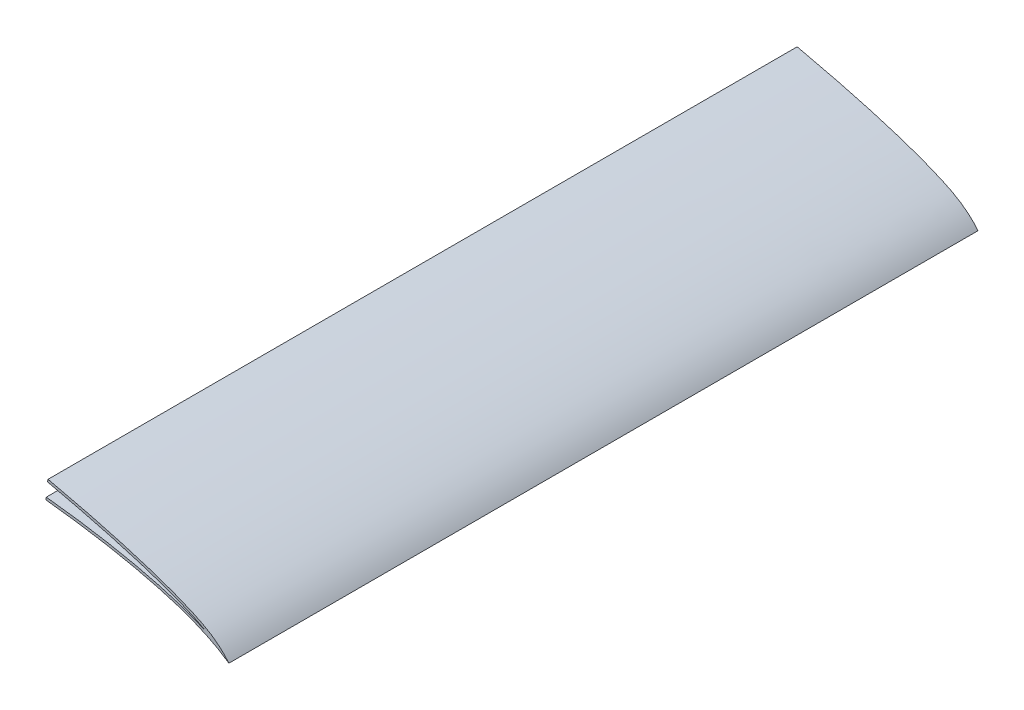
ISO-10303-21;
HEADER;
FILE_DESCRIPTION(('STEP AP214'),'2;1');
FILE_NAME('part.step','',(''),(''),'','','');
FILE_SCHEMA(('AUTOMOTIVE_DESIGN { 1 0 10303 214 1 1 1 1 }'));
ENDSEC;
DATA;
#1=APPLICATION_CONTEXT('core data for automotive mechanical design processes');
#2=APPLICATION_PROTOCOL_DEFINITION('international standard','automotive_design',2000,#1);
#3=PRODUCT_CONTEXT('',#1,'mechanical');
#4=PRODUCT('Part','Part','',(#3));
#5=PRODUCT_RELATED_PRODUCT_CATEGORY('part','',(#4));
#6=PRODUCT_DEFINITION_FORMATION('','',#4);
#7=PRODUCT_DEFINITION_CONTEXT('part definition',#1,'design');
#8=PRODUCT_DEFINITION('design','',#6,#7);
#9=PRODUCT_DEFINITION_SHAPE('','',#8);
#10=(LENGTH_UNIT() NAMED_UNIT(*) SI_UNIT(.MILLI.,.METRE.));
#11=(NAMED_UNIT(*) PLANE_ANGLE_UNIT() SI_UNIT($,.RADIAN.));
#12=(NAMED_UNIT(*) SI_UNIT($,.STERADIAN.) SOLID_ANGLE_UNIT());
#13=UNCERTAINTY_MEASURE_WITH_UNIT(LENGTH_MEASURE(1.E-05),#10,'distance_accuracy_value','');
#14=(GEOMETRIC_REPRESENTATION_CONTEXT(3) GLOBAL_UNCERTAINTY_ASSIGNED_CONTEXT((#13)) GLOBAL_UNIT_ASSIGNED_CONTEXT((#10,
#11,#12)) REPRESENTATION_CONTEXT('',''));
#15=CARTESIAN_POINT('',(0.,0.,0.));
#16=DIRECTION('',(0.,0.,1.));
#17=DIRECTION('',(1.,0.,0.));
#18=AXIS2_PLACEMENT_3D('',#15,#16,#17);
#19=CARTESIAN_POINT('',(681.10239979939,357.442024641771,-776.88119407791));
#20=CARTESIAN_POINT('',(679.304249684024,358.507222216952,-776.88119407791));
#21=CARTESIAN_POINT('',(675.611115854921,360.442697269166,-776.88119407791));
#22=CARTESIAN_POINT('',(667.897968409566,363.914761834944,-776.88119407791));
#23=CARTESIAN_POINT('',(658.02890147387,367.768621452563,-776.88119407791));
#24=CARTESIAN_POINT('',(645.962941296988,371.875785824504,-776.88119407791));
#25=CARTESIAN_POINT('',(629.698668264069,376.857765233191,-776.88119407791));
#26=CARTESIAN_POINT('',(609.14271959352,382.390632282122,-776.88119407791));
#27=CARTESIAN_POINT('',(592.558644621646,386.308749724352,-776.88119407791));
#28=CARTESIAN_POINT('',(584.246414259336,388.168240850974,-776.88119407791));
#29=B_SPLINE_CURVE_WITH_KNOTS('',3,(#19,#20,#21,#22,#23,#24,#25,#26,#27,#28),.UNSPECIFIED.,.F.,
.F.,(4,1,1,1,1,1,1,4),(0.0310566948795872,0.0410473310177227,0.0510379671558582,
0.0710192394321292,0.0910005117084002,0.110981783984671,0.150944328537213,0.190906873089755),.UNSPECIFIED.);
#30=DIRECTION('',(0.,0.,1.));
#31=VECTOR('',#30,1.);
#32=SURFACE_OF_LINEAR_EXTRUSION('',#29,#31);
#33=CARTESIAN_POINT('',(681.10239979939,357.442024641771,-319.68119407791));
#34=CARTESIAN_POINT('',(679.304249684024,358.507222216952,-319.68119407791));
#35=CARTESIAN_POINT('',(675.611115854921,360.442697269166,-319.68119407791));
#36=CARTESIAN_POINT('',(667.897968409566,363.914761834944,-319.68119407791));
#37=CARTESIAN_POINT('',(658.02890147387,367.768621452563,-319.68119407791));
#38=CARTESIAN_POINT('',(645.962941296988,371.875785824504,-319.68119407791));
#39=CARTESIAN_POINT('',(629.698668264069,376.857765233191,-319.68119407791));
#40=CARTESIAN_POINT('',(609.14271959352,382.390632282122,-319.68119407791));
#41=CARTESIAN_POINT('',(592.558644621646,386.308749724352,-319.68119407791));
#42=CARTESIAN_POINT('',(584.246414259336,388.168240850974,-319.68119407791));
#43=B_SPLINE_CURVE_WITH_KNOTS('',3,(#33,#34,#35,#36,#37,#38,#39,#40,#41,#42),.UNSPECIFIED.,.F.,
.F.,(4,1,1,1,1,1,1,4),(0.0310566948795872,0.0410473310177227,0.0510379671558582,
0.0710192394321292,0.0910005117084002,0.110981783984671,0.150944328537213,0.190906873089755),.UNSPECIFIED.);
#44=CARTESIAN_POINT('',(681.10239979939,357.442024641771,-319.68119407791));
#45=VERTEX_POINT('',#44);
#46=CARTESIAN_POINT('',(584.246414259336,388.168240850974,-319.68119407791));
#47=VERTEX_POINT('',#46);
#48=EDGE_CURVE('E126',#45,#47,#43,.T.);
#49=ORIENTED_EDGE('',*,*,#48,.T.);
#50=DIRECTION('',(0.,0.,1.));
#51=VECTOR('',#50,1.);
#52=CARTESIAN_POINT('',(584.246414259336,388.168240850974,-776.88119407791));
#53=LINE('',#52,#51);
#54=CARTESIAN_POINT('',(584.246414259336,388.168240850974,-776.88119407791));
#55=VERTEX_POINT('',#54);
#56=EDGE_CURVE('E39',#55,#47,#53,.T.);
#57=ORIENTED_EDGE('',*,*,#56,.F.);
#58=CARTESIAN_POINT('',(681.10239979939,357.442024641771,-776.88119407791));
#59=VERTEX_POINT('',#58);
#60=EDGE_CURVE('E155',#59,#55,#29,.T.);
#61=ORIENTED_EDGE('',*,*,#60,.F.);
#62=DIRECTION('',(0.,0.,1.));
#63=VECTOR('',#62,1.);
#64=CARTESIAN_POINT('',(681.10239979939,357.442024641771,-776.88119407791));
#65=LINE('',#64,#63);
#66=EDGE_CURVE('E11',#59,#45,#65,.T.);
#67=ORIENTED_EDGE('',*,*,#66,.T.);
#68=EDGE_LOOP('',(#49,#57,#61,#67));
#69=FACE_BOUND('',#68,.T.);
#70=ADVANCED_FACE('F35',(#69),#32,.F.);
#71=CARTESIAN_POINT('',(583.510331137067,379.741149772631,-776.88119407791));
#72=CARTESIAN_POINT('',(591.8136724064,378.84005328922,-776.88119407791));
#73=CARTESIAN_POINT('',(608.384907828173,376.714386581783,-776.88119407791));
#74=CARTESIAN_POINT('',(633.079929040534,372.32439926868,-776.88119407791));
#75=CARTESIAN_POINT('',(653.436794257841,367.438773544325,-776.88119407791));
#76=CARTESIAN_POINT('',(669.437307682216,362.364981006689,-776.88119407791));
#77=CARTESIAN_POINT('',(677.28280112468,359.2195131916,-776.88119407791));
#78=CARTESIAN_POINT('',(681.10239979939,357.442024641771,-776.88119407791));
#79=B_SPLINE_CURVE_WITH_KNOTS('',3,(#71,#72,#73,#74,#75,#76,#77,#78),.UNSPECIFIED.,.F.,.F.,(4,1,
1,1,1,4),(0.805836243842012,0.846446639249514,0.887057034657015,0.927667430064517,
0.947972627768268,0.968277825472018),.UNSPECIFIED.);
#80=DIRECTION('',(0.,0.,1.));
#81=VECTOR('',#80,1.);
#82=SURFACE_OF_LINEAR_EXTRUSION('',#79,#81);
#83=CARTESIAN_POINT('',(583.510331137067,379.741149772631,-319.68119407791));
#84=CARTESIAN_POINT('',(591.8136724064,378.84005328922,-319.68119407791));
#85=CARTESIAN_POINT('',(608.384907828173,376.714386581783,-319.68119407791));
#86=CARTESIAN_POINT('',(633.079929040534,372.32439926868,-319.68119407791));
#87=CARTESIAN_POINT('',(653.436794257841,367.438773544325,-319.68119407791));
#88=CARTESIAN_POINT('',(669.437307682216,362.364981006689,-319.68119407791));
#89=CARTESIAN_POINT('',(677.28280112468,359.2195131916,-319.68119407791));
#90=CARTESIAN_POINT('',(681.10239979939,357.442024641771,-319.68119407791));
#91=B_SPLINE_CURVE_WITH_KNOTS('',3,(#83,#84,#85,#86,#87,#88,#89,#90),.UNSPECIFIED.,.F.,.F.,(4,1,
1,1,1,4),(0.805836243842012,0.846446639249514,0.887057034657015,0.927667430064517,
0.947972627768268,0.968277825472018),.UNSPECIFIED.);
#92=CARTESIAN_POINT('',(583.510331137067,379.741149772631,-319.68119407791));
#93=VERTEX_POINT('',#92);
#94=EDGE_CURVE('E83',#93,#45,#91,.T.);
#95=ORIENTED_EDGE('',*,*,#94,.T.);
#96=ORIENTED_EDGE('',*,*,#66,.F.);
#97=CARTESIAN_POINT('',(583.510331137067,379.741149772631,-776.88119407791));
#98=VERTEX_POINT('',#97);
#99=EDGE_CURVE('E54',#98,#59,#79,.T.);
#100=ORIENTED_EDGE('',*,*,#99,.F.);
#101=DIRECTION('',(0.,0.,1.));
#102=VECTOR('',#101,1.);
#103=CARTESIAN_POINT('',(583.510331137067,379.741149772631,-776.88119407791));
#104=LINE('',#103,#102);
#105=EDGE_CURVE('E45',#98,#93,#104,.T.);
#106=ORIENTED_EDGE('',*,*,#105,.T.);
#107=EDGE_LOOP('',(#95,#96,#100,#106));
#108=FACE_BOUND('',#107,.T.);
#109=ADVANCED_FACE('F134',(#108),#82,.F.);
#110=CARTESIAN_POINT('',(583.510331137067,379.741149772631,-776.88119407791));
#111=DIRECTION('',(-0.994162977907549,0.107888708204309,0.));
#112=DIRECTION('',(-0.107888708204309,-0.994162977907549,0.));
#113=AXIS2_PLACEMENT_3D('',#110,#111,#112);
#114=PLANE('',#113);
#115=DIRECTION('',(0.107888708204309,0.994162977907549,0.));
#116=VECTOR('',#115,1.);
#117=CARTESIAN_POINT('',(583.510331137067,379.741149772631,-319.68119407791));
#118=LINE('',#117,#116);
#119=CARTESIAN_POINT('',(583.339057812792,378.162916045203,-319.68119407791));
#120=VERTEX_POINT('',#119);
#121=EDGE_CURVE('E77',#120,#93,#118,.T.);
#122=ORIENTED_EDGE('',*,*,#121,.T.);
#123=ORIENTED_EDGE('',*,*,#105,.F.);
#124=DIRECTION('',(0.107888708204309,0.994162977907549,0.));
#125=VECTOR('',#124,1.);
#126=CARTESIAN_POINT('',(583.510331137067,379.741149772631,-776.88119407791));
#127=LINE('',#126,#125);
#128=CARTESIAN_POINT('',(583.339057812792,378.162916045203,-776.88119407791));
#129=VERTEX_POINT('',#128);
#130=EDGE_CURVE('E102',#129,#98,#127,.T.);
#131=ORIENTED_EDGE('',*,*,#130,.F.);
#132=DIRECTION('',(0.,0.,1.));
#133=VECTOR('',#132,1.);
#134=CARTESIAN_POINT('',(583.339057812792,378.162916045203,-776.88119407791));
#135=LINE('',#134,#133);
#136=EDGE_CURVE('E109',#129,#120,#135,.T.);
#137=ORIENTED_EDGE('',*,*,#136,.T.);
#138=EDGE_LOOP('',(#122,#123,#131,#137));
#139=FACE_BOUND('',#138,.T.);
#140=ADVANCED_FACE('F115',(#139),#114,.T.);
#141=CARTESIAN_POINT('',(694.960862648591,347.678083459518,-776.88119407791));
#142=CARTESIAN_POINT('',(691.029024667533,350.467217019644,-776.88119407791));
#143=CARTESIAN_POINT('',(682.671305419235,355.295271927614,-776.88119407791));
#144=CARTESIAN_POINT('',(669.098277724682,360.859120529805,-776.88119407791));
#145=CARTESIAN_POINT('',(655.150353556945,365.206363312461,-776.88119407791));
#146=CARTESIAN_POINT('',(636.268825679498,370.004149324542,-776.88119407791));
#147=CARTESIAN_POINT('',(612.334315947761,374.563254744285,-776.88119407791));
#148=CARTESIAN_POINT('',(593.01938034853,377.112386588168,-776.88119407791));
#149=CARTESIAN_POINT('',(583.339057812792,378.162916045203,-776.88119407791));
#150=B_SPLINE_CURVE_WITH_KNOTS('',3,(#141,#142,#143,#144,#145,#146,#147,#148,#149),
.UNSPECIFIED.,.F.,.F.,(4,1,1,1,1,1,4),(0.778364638353046,0.802103786742917,0.825842935132789,
0.84958208352266,0.873321231912532,0.920799528692275,0.968277825472017),.UNSPECIFIED.);
#151=DIRECTION('',(0.,0.,1.));
#152=VECTOR('',#151,1.);
#153=SURFACE_OF_LINEAR_EXTRUSION('',#150,#152);
#154=CARTESIAN_POINT('',(694.960862648591,347.678083459518,-319.68119407791));
#155=CARTESIAN_POINT('',(691.029024667533,350.467217019644,-319.68119407791));
#156=CARTESIAN_POINT('',(682.671305419235,355.295271927614,-319.68119407791));
#157=CARTESIAN_POINT('',(669.098277724682,360.859120529805,-319.68119407791));
#158=CARTESIAN_POINT('',(655.150353556945,365.206363312461,-319.68119407791));
#159=CARTESIAN_POINT('',(636.268825679498,370.004149324542,-319.68119407791));
#160=CARTESIAN_POINT('',(612.334315947761,374.563254744285,-319.68119407791));
#161=CARTESIAN_POINT('',(593.01938034853,377.112386588168,-319.68119407791));
#162=CARTESIAN_POINT('',(583.339057812792,378.162916045203,-319.68119407791));
#163=B_SPLINE_CURVE_WITH_KNOTS('',3,(#154,#155,#156,#157,#158,#159,#160,#161,#162),
.UNSPECIFIED.,.F.,.F.,(4,1,1,1,1,1,4),(0.778364638353046,0.802103786742917,0.825842935132789,
0.84958208352266,0.873321231912532,0.920799528692275,0.968277825472017),.UNSPECIFIED.);
#164=CARTESIAN_POINT('',(694.960862648591,347.678083459518,-319.68119407791));
#165=VERTEX_POINT('',#164);
#166=EDGE_CURVE('E112',#165,#120,#163,.T.);
#167=ORIENTED_EDGE('',*,*,#166,.T.);
#168=ORIENTED_EDGE('',*,*,#136,.F.);
#169=CARTESIAN_POINT('',(694.960862648591,347.678083459518,-776.88119407791));
#170=VERTEX_POINT('',#169);
#171=EDGE_CURVE('E98',#170,#129,#150,.T.);
#172=ORIENTED_EDGE('',*,*,#171,.F.);
#173=DIRECTION('',(0.,0.,1.));
#174=VECTOR('',#173,1.);
#175=CARTESIAN_POINT('',(694.960862648591,347.678083459518,-776.88119407791));
#176=LINE('',#175,#174);
#177=EDGE_CURVE('E113',#170,#165,#176,.T.);
#178=ORIENTED_EDGE('',*,*,#177,.T.);
#179=EDGE_LOOP('',(#167,#168,#172,#178));
#180=FACE_BOUND('',#179,.T.);
#181=ADVANCED_FACE('F110',(#180),#153,.F.);
#182=CARTESIAN_POINT('',(584.592980694727,389.717449667067,-776.88119407791));
#183=CARTESIAN_POINT('',(594.2390289314,387.559576229826,-776.88119407791));
#184=CARTESIAN_POINT('',(608.665062264766,384.125823447073,-776.88119407791));
#185=CARTESIAN_POINT('',(627.762599784587,379.000812102591,-776.88119407791));
#186=CARTESIAN_POINT('',(641.985832617223,374.815696622757,-776.88119407791));
#187=CARTESIAN_POINT('',(653.728443854595,370.955138889617,-776.88119407791));
#188=CARTESIAN_POINT('',(663.00422729933,367.537908093301,-776.88119407791));
#189=CARTESIAN_POINT('',(669.877072896808,364.763096926528,-776.88119407791));
#190=CARTESIAN_POINT('',(676.654462618841,361.727818738977,-776.88119407791));
#191=CARTESIAN_POINT('',(682.087698437832,358.81395797082,-776.88119407791));
#192=CARTESIAN_POINT('',(686.264097225263,356.011835466178,-776.88119407791));
#193=CARTESIAN_POINT('',(689.293606327259,353.621302194878,-776.88119407791));
#194=CARTESIAN_POINT('',(691.722959725977,351.338504762297,-776.88119407791));
#195=CARTESIAN_POINT('',(693.593228521658,349.322103903293,-776.88119407791));
#196=CARTESIAN_POINT('',(694.516463088209,348.229332832381,-776.88119407791));
#197=CARTESIAN_POINT('',(694.960862648591,347.678083459518,-776.88119407791));
#198=B_SPLINE_CURVE_WITH_KNOTS('',3,(#182,#183,#184,#185,#186,#187,#188,#189,#190,#191,#192,
#193,#194,#195,#196,#197),.UNSPECIFIED.,.F.,.F.,(4,1,1,1,1,1,1,1,1,1,1,1,1,4),
(0.0310566948795878,0.0773530996556797,0.100501302043726,0.123649504431772,0.146797706819817,
0.15837180801384,0.169945909207863,0.181520010401886,0.193094111595909,0.198881162192921,
0.204668212789932,0.210455263386944,0.213348788685449,0.216242313983955),.UNSPECIFIED.);
#199=DIRECTION('',(0.,0.,1.));
#200=VECTOR('',#199,1.);
#201=SURFACE_OF_LINEAR_EXTRUSION('',#198,#200);
#202=CARTESIAN_POINT('',(584.592980694727,389.717449667067,-319.68119407791));
#203=CARTESIAN_POINT('',(594.2390289314,387.559576229826,-319.68119407791));
#204=CARTESIAN_POINT('',(608.665062264766,384.125823447073,-319.68119407791));
#205=CARTESIAN_POINT('',(627.762599784587,379.000812102591,-319.68119407791));
#206=CARTESIAN_POINT('',(641.985832617223,374.815696622757,-319.68119407791));
#207=CARTESIAN_POINT('',(653.728443854595,370.955138889617,-319.68119407791));
#208=CARTESIAN_POINT('',(663.00422729933,367.537908093301,-319.68119407791));
#209=CARTESIAN_POINT('',(669.877072896808,364.763096926528,-319.68119407791));
#210=CARTESIAN_POINT('',(676.654462618841,361.727818738977,-319.68119407791));
#211=CARTESIAN_POINT('',(682.087698437832,358.81395797082,-319.68119407791));
#212=CARTESIAN_POINT('',(686.264097225263,356.011835466178,-319.68119407791));
#213=CARTESIAN_POINT('',(689.293606327259,353.621302194878,-319.68119407791));
#214=CARTESIAN_POINT('',(691.722959725977,351.338504762297,-319.68119407791));
#215=CARTESIAN_POINT('',(693.593228521658,349.322103903293,-319.68119407791));
#216=CARTESIAN_POINT('',(694.516463088209,348.229332832381,-319.68119407791));
#217=CARTESIAN_POINT('',(694.960862648591,347.678083459518,-319.68119407791));
#218=B_SPLINE_CURVE_WITH_KNOTS('',3,(#202,#203,#204,#205,#206,#207,#208,#209,#210,#211,#212,
#213,#214,#215,#216,#217),.UNSPECIFIED.,.F.,.F.,(4,1,1,1,1,1,1,1,1,1,1,1,1,4),
(0.0310566948795878,0.0773530996556797,0.100501302043726,0.123649504431772,0.146797706819817,
0.15837180801384,0.169945909207863,0.181520010401886,0.193094111595909,0.198881162192921,
0.204668212789932,0.210455263386944,0.213348788685449,0.216242313983955),.UNSPECIFIED.);
#219=CARTESIAN_POINT('',(584.592980694727,389.717449667067,-319.68119407791));
#220=VERTEX_POINT('',#219);
#221=EDGE_CURVE('E182',#220,#165,#218,.T.);
#222=ORIENTED_EDGE('',*,*,#221,.T.);
#223=ORIENTED_EDGE('',*,*,#177,.F.);
#224=CARTESIAN_POINT('',(584.592980694727,389.717449667067,-776.88119407791));
#225=VERTEX_POINT('',#224);
#226=EDGE_CURVE('E104',#225,#170,#198,.T.);
#227=ORIENTED_EDGE('',*,*,#226,.F.);
#228=DIRECTION('',(0.,0.,1.));
#229=VECTOR('',#228,1.);
#230=CARTESIAN_POINT('',(584.592980694727,389.717449667067,-776.88119407791));
#231=LINE('',#230,#229);
#232=EDGE_CURVE('E174',#225,#220,#231,.T.);
#233=ORIENTED_EDGE('',*,*,#232,.T.);
#234=EDGE_LOOP('',(#222,#223,#227,#233));
#235=FACE_BOUND('',#234,.T.);
#236=ADVANCED_FACE('F144',(#235),#201,.F.);
#237=CARTESIAN_POINT('',(584.246414259336,388.168240850974,-776.88119407791));
#238=DIRECTION('',(-0.975879569192483,0.218309565600535,0.));
#239=DIRECTION('',(-0.218309565600535,-0.975879569192483,0.));
#240=AXIS2_PLACEMENT_3D('',#237,#238,#239);
#241=PLANE('',#240);
#242=DIRECTION('',(0.218309565600535,0.975879569192483,0.));
#243=VECTOR('',#242,1.);
#244=CARTESIAN_POINT('',(584.246414259336,388.168240850974,-319.68119407791));
#245=LINE('',#244,#243);
#246=EDGE_CURVE('E178',#47,#220,#245,.T.);
#247=ORIENTED_EDGE('',*,*,#246,.T.);
#248=ORIENTED_EDGE('',*,*,#232,.F.);
#249=DIRECTION('',(0.218309565600535,0.975879569192483,0.));
#250=VECTOR('',#249,1.);
#251=CARTESIAN_POINT('',(584.246414259336,388.168240850974,-776.88119407791));
#252=LINE('',#251,#250);
#253=EDGE_CURVE('E91',#55,#225,#252,.T.);
#254=ORIENTED_EDGE('',*,*,#253,.F.);
#255=ORIENTED_EDGE('',*,*,#56,.T.);
#256=EDGE_LOOP('',(#247,#248,#254,#255));
#257=FACE_BOUND('',#256,.T.);
#258=ADVANCED_FACE('F146',(#257),#241,.T.);
#259=CARTESIAN_POINT('',(633.749696030339,375.565963233557,-776.88119407791));
#260=DIRECTION('',(0.,0.,-1.));
#261=DIRECTION('',(1.,0.,0.));
#262=AXIS2_PLACEMENT_3D('',#259,#260,#261);
#263=PLANE('',#262);
#264=ORIENTED_EDGE('',*,*,#60,.T.);
#265=ORIENTED_EDGE('',*,*,#253,.T.);
#266=ORIENTED_EDGE('',*,*,#226,.T.);
#267=ORIENTED_EDGE('',*,*,#171,.T.);
#268=ORIENTED_EDGE('',*,*,#130,.T.);
#269=ORIENTED_EDGE('',*,*,#99,.T.);
#270=EDGE_LOOP('',(#264,#265,#266,#267,#268,#269));
#271=FACE_BOUND('',#270,.T.);
#272=ADVANCED_FACE('F100',(#271),#263,.T.);
#273=CARTESIAN_POINT('',(633.749696030339,375.565963233557,-319.68119407791));
#274=DIRECTION('',(0.,0.,-1.));
#275=DIRECTION('',(1.,0.,0.));
#276=AXIS2_PLACEMENT_3D('',#273,#274,#275);
#277=PLANE('',#276);
#278=ORIENTED_EDGE('',*,*,#48,.F.);
#279=ORIENTED_EDGE('',*,*,#94,.F.);
#280=ORIENTED_EDGE('',*,*,#121,.F.);
#281=ORIENTED_EDGE('',*,*,#166,.F.);
#282=ORIENTED_EDGE('',*,*,#221,.F.);
#283=ORIENTED_EDGE('',*,*,#246,.F.);
#284=EDGE_LOOP('',(#278,#279,#280,#281,#282,#283));
#285=FACE_BOUND('',#284,.T.);
#286=ADVANCED_FACE('F138',(#285),#277,.F.);
#287=CLOSED_SHELL('',(#70,#109,#140,#181,#236,#258,#272,#286));
#288=MANIFOLD_SOLID_BREP('B2',#287);
#289=ADVANCED_BREP_SHAPE_REPRESENTATION('',(#18,#288),#14);
#290=SHAPE_DEFINITION_REPRESENTATION(#9,#289);
ENDSEC;
END-ISO-10303-21;
